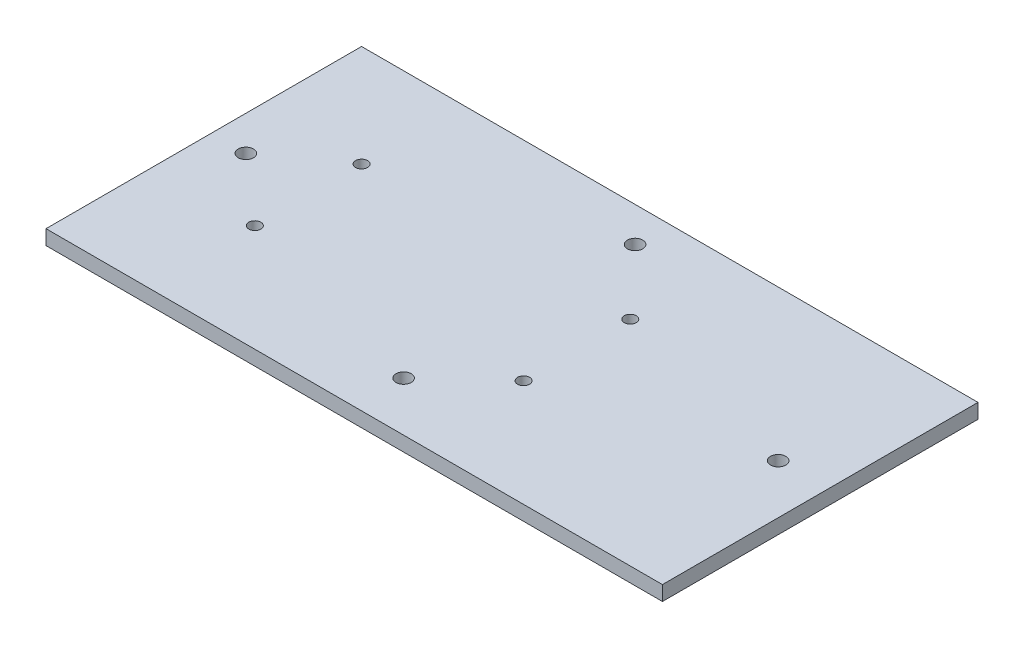
ISO-10303-21;
HEADER;
FILE_DESCRIPTION(('STEP AP214'),'2;1');
FILE_NAME('part.step','',(''),(''),'','','');
FILE_SCHEMA(('AUTOMOTIVE_DESIGN { 1 0 10303 214 1 1 1 1 }'));
ENDSEC;
DATA;
#1=APPLICATION_CONTEXT('core data for automotive mechanical design processes');
#2=APPLICATION_PROTOCOL_DEFINITION('international standard','automotive_design',2000,#1);
#3=PRODUCT_CONTEXT('',#1,'mechanical');
#4=PRODUCT('Part','Part','',(#3));
#5=PRODUCT_RELATED_PRODUCT_CATEGORY('part','',(#4));
#6=PRODUCT_DEFINITION_FORMATION('','',#4);
#7=PRODUCT_DEFINITION_CONTEXT('part definition',#1,'design');
#8=PRODUCT_DEFINITION('design','',#6,#7);
#9=PRODUCT_DEFINITION_SHAPE('','',#8);
#10=(LENGTH_UNIT() NAMED_UNIT(*) SI_UNIT(.MILLI.,.METRE.));
#11=(NAMED_UNIT(*) PLANE_ANGLE_UNIT() SI_UNIT($,.RADIAN.));
#12=(NAMED_UNIT(*) SI_UNIT($,.STERADIAN.) SOLID_ANGLE_UNIT());
#13=UNCERTAINTY_MEASURE_WITH_UNIT(LENGTH_MEASURE(1.E-05),#10,'distance_accuracy_value','');
#14=(GEOMETRIC_REPRESENTATION_CONTEXT(3) GLOBAL_UNCERTAINTY_ASSIGNED_CONTEXT((#13)) GLOBAL_UNIT_ASSIGNED_CONTEXT((#10,
#11,#12)) REPRESENTATION_CONTEXT('',''));
#15=CARTESIAN_POINT('',(0.,0.,0.));
#16=DIRECTION('',(0.,0.,1.));
#17=DIRECTION('',(1.,0.,0.));
#18=AXIS2_PLACEMENT_3D('',#15,#16,#17);
#19=CARTESIAN_POINT('',(0.,3.175,0.));
#20=DIRECTION('',(0.,1.,0.));
#21=DIRECTION('',(0.,0.,1.));
#22=AXIS2_PLACEMENT_3D('',#19,#20,#21);
#23=PLANE('',#22);
#24=CARTESIAN_POINT('',(13.4625,3.175,10.9625));
#25=DIRECTION('',(0.,1.,0.));
#26=DIRECTION('',(0.,0.,1.));
#27=AXIS2_PLACEMENT_3D('',#24,#25,#26);
#28=CIRCLE('',#27,1.3);
#29=CARTESIAN_POINT('',(13.4625,3.175,9.6625));
#30=VERTEX_POINT('',#29);
#31=EDGE_CURVE('E142',#30,#30,#28,.F.);
#32=ORIENTED_EDGE('',*,*,#31,.T.);
#33=EDGE_LOOP('',(#32));
#34=FACE_BOUND('',#33,.T.);
#35=CARTESIAN_POINT('',(13.4625,3.175,-12.0875));
#36=DIRECTION('',(0.,1.,0.));
#37=DIRECTION('',(0.,0.,1.));
#38=AXIS2_PLACEMENT_3D('',#35,#36,#37);
#39=CIRCLE('',#38,1.3);
#40=CARTESIAN_POINT('',(13.4625,3.175,-13.3875));
#41=VERTEX_POINT('',#40);
#42=EDGE_CURVE('E149',#41,#41,#39,.F.);
#43=ORIENTED_EDGE('',*,*,#42,.T.);
#44=EDGE_LOOP('',(#43));
#45=FACE_BOUND('',#44,.T.);
#46=CARTESIAN_POINT('',(-44.5875,3.175,-12.0875));
#47=DIRECTION('',(0.,1.,0.));
#48=DIRECTION('',(0.,0.,1.));
#49=AXIS2_PLACEMENT_3D('',#46,#47,#48);
#50=CIRCLE('',#49,1.3);
#51=CARTESIAN_POINT('',(-44.5875,3.175,-13.3875));
#52=VERTEX_POINT('',#51);
#53=EDGE_CURVE('E141',#52,#52,#50,.F.);
#54=ORIENTED_EDGE('',*,*,#53,.T.);
#55=EDGE_LOOP('',(#54));
#56=FACE_BOUND('',#55,.T.);
#57=CARTESIAN_POINT('',(-44.5875,3.175,10.9625));
#58=DIRECTION('',(0.,1.,0.));
#59=DIRECTION('',(0.,0.,1.));
#60=AXIS2_PLACEMENT_3D('',#57,#58,#59);
#61=CIRCLE('',#60,1.3);
#62=CARTESIAN_POINT('',(-44.5875,3.175,9.6625));
#63=VERTEX_POINT('',#62);
#64=EDGE_CURVE('E133',#63,#63,#61,.F.);
#65=ORIENTED_EDGE('',*,*,#64,.T.);
#66=EDGE_LOOP('',(#65));
#67=FACE_BOUND('',#66,.T.);
#68=CARTESIAN_POINT('',(55.9125,3.175,-1.5875));
#69=DIRECTION('',(0.,1.,0.));
#70=DIRECTION('',(0.,0.,1.));
#71=AXIS2_PLACEMENT_3D('',#68,#69,#70);
#72=CIRCLE('',#71,1.65);
#73=CARTESIAN_POINT('',(55.9125,3.175,0.0625000000000024));
#74=VERTEX_POINT('',#73);
#75=EDGE_CURVE('E121',#74,#74,#72,.T.);
#76=ORIENTED_EDGE('',*,*,#75,.F.);
#77=EDGE_LOOP('',(#76));
#78=FACE_BOUND('',#77,.T.);
#79=CARTESIAN_POINT('',(0.,3.175,-26.5875));
#80=DIRECTION('',(0.,1.,0.));
#81=DIRECTION('',(0.,0.,1.));
#82=AXIS2_PLACEMENT_3D('',#79,#80,#81);
#83=CIRCLE('',#82,1.65);
#84=CARTESIAN_POINT('',(0.,3.175,-24.9375));
#85=VERTEX_POINT('',#84);
#86=EDGE_CURVE('E100',#85,#85,#83,.T.);
#87=ORIENTED_EDGE('',*,*,#86,.F.);
#88=EDGE_LOOP('',(#87));
#89=FACE_BOUND('',#88,.T.);
#90=DIRECTION('',(0.,0.,-1.));
#91=VECTOR('',#90,1.);
#92=CARTESIAN_POINT('',(66.5875,3.175,-34.0875));
#93=LINE('',#92,#91);
#94=CARTESIAN_POINT('',(66.5875,3.175,34.0875));
#95=VERTEX_POINT('',#94);
#96=CARTESIAN_POINT('',(66.5875,3.175,-34.0875));
#97=VERTEX_POINT('',#96);
#98=EDGE_CURVE('E85',#95,#97,#93,.T.);
#99=ORIENTED_EDGE('',*,*,#98,.T.);
#100=DIRECTION('',(-1.,0.,0.));
#101=VECTOR('',#100,1.);
#102=CARTESIAN_POINT('',(-66.5875,3.175,-34.0875));
#103=LINE('',#102,#101);
#104=CARTESIAN_POINT('',(-66.5875,3.175,-34.0875));
#105=VERTEX_POINT('',#104);
#106=EDGE_CURVE('E80',#97,#105,#103,.T.);
#107=ORIENTED_EDGE('',*,*,#106,.T.);
#108=DIRECTION('',(0.,0.,1.));
#109=VECTOR('',#108,1.);
#110=CARTESIAN_POINT('',(-66.5875,3.175,-34.0875));
#111=LINE('',#110,#109);
#112=CARTESIAN_POINT('',(-66.5875,3.175,34.0875));
#113=VERTEX_POINT('',#112);
#114=EDGE_CURVE('E83',#105,#113,#111,.T.);
#115=ORIENTED_EDGE('',*,*,#114,.T.);
#116=DIRECTION('',(1.,0.,0.));
#117=VECTOR('',#116,1.);
#118=CARTESIAN_POINT('',(-66.5875,3.175,34.0875));
#119=LINE('',#118,#117);
#120=EDGE_CURVE('E50',#113,#95,#119,.T.);
#121=ORIENTED_EDGE('',*,*,#120,.T.);
#122=EDGE_LOOP('',(#99,#107,#115,#121));
#123=FACE_BOUND('',#122,.T.);
#124=CARTESIAN_POINT('',(-59.0875,3.175,-1.5875));
#125=DIRECTION('',(0.,1.,0.));
#126=DIRECTION('',(0.,0.,1.));
#127=AXIS2_PLACEMENT_3D('',#124,#125,#126);
#128=CIRCLE('',#127,1.65);
#129=CARTESIAN_POINT('',(-59.0875,3.175,0.0625000000000024));
#130=VERTEX_POINT('',#129);
#131=EDGE_CURVE('E115',#130,#130,#128,.T.);
#132=ORIENTED_EDGE('',*,*,#131,.F.);
#133=EDGE_LOOP('',(#132));
#134=FACE_BOUND('',#133,.T.);
#135=CARTESIAN_POINT('',(0.,3.175,23.4125));
#136=DIRECTION('',(0.,1.,0.));
#137=DIRECTION('',(0.,0.,1.));
#138=AXIS2_PLACEMENT_3D('',#135,#136,#137);
#139=CIRCLE('',#138,1.65);
#140=CARTESIAN_POINT('',(0.,3.175,25.0625));
#141=VERTEX_POINT('',#140);
#142=EDGE_CURVE('E127',#141,#141,#139,.T.);
#143=ORIENTED_EDGE('',*,*,#142,.F.);
#144=EDGE_LOOP('',(#143));
#145=FACE_BOUND('',#144,.T.);
#146=ADVANCED_FACE('F33',(#34,#45,#56,#67,#78,#89,#123,#134,#145),#23,.T.);
#147=CARTESIAN_POINT('',(0.,0.,0.));
#148=DIRECTION('',(0.,1.,0.));
#149=DIRECTION('',(0.,0.,1.));
#150=AXIS2_PLACEMENT_3D('',#147,#148,#149);
#151=PLANE('',#150);
#152=CARTESIAN_POINT('',(13.4625,0.,10.9625));
#153=DIRECTION('',(0.,-1.,0.));
#154=DIRECTION('',(0.,0.,-1.));
#155=AXIS2_PLACEMENT_3D('',#152,#153,#154);
#156=CIRCLE('',#155,1.3);
#157=CARTESIAN_POINT('',(13.4625,0.,9.6625));
#158=VERTEX_POINT('',#157);
#159=EDGE_CURVE('E146',#158,#158,#156,.T.);
#160=ORIENTED_EDGE('',*,*,#159,.F.);
#161=EDGE_LOOP('',(#160));
#162=FACE_BOUND('',#161,.T.);
#163=CARTESIAN_POINT('',(13.4625,0.,-12.0875));
#164=DIRECTION('',(0.,-1.,0.));
#165=DIRECTION('',(0.,0.,-1.));
#166=AXIS2_PLACEMENT_3D('',#163,#164,#165);
#167=CIRCLE('',#166,1.3);
#168=CARTESIAN_POINT('',(13.4625,0.,-13.3875));
#169=VERTEX_POINT('',#168);
#170=EDGE_CURVE('E145',#169,#169,#167,.T.);
#171=ORIENTED_EDGE('',*,*,#170,.F.);
#172=EDGE_LOOP('',(#171));
#173=FACE_BOUND('',#172,.T.);
#174=CARTESIAN_POINT('',(-44.5875,0.,-12.0875));
#175=DIRECTION('',(0.,-1.,0.));
#176=DIRECTION('',(0.,0.,-1.));
#177=AXIS2_PLACEMENT_3D('',#174,#175,#176);
#178=CIRCLE('',#177,1.3);
#179=CARTESIAN_POINT('',(-44.5875,0.,-13.3875));
#180=VERTEX_POINT('',#179);
#181=EDGE_CURVE('E152',#180,#180,#178,.T.);
#182=ORIENTED_EDGE('',*,*,#181,.F.);
#183=EDGE_LOOP('',(#182));
#184=FACE_BOUND('',#183,.T.);
#185=CARTESIAN_POINT('',(-44.5875,0.,10.9625));
#186=DIRECTION('',(0.,-1.,0.));
#187=DIRECTION('',(0.,0.,-1.));
#188=AXIS2_PLACEMENT_3D('',#185,#186,#187);
#189=CIRCLE('',#188,1.3);
#190=CARTESIAN_POINT('',(-44.5875,0.,9.6625));
#191=VERTEX_POINT('',#190);
#192=EDGE_CURVE('E138',#191,#191,#189,.T.);
#193=ORIENTED_EDGE('',*,*,#192,.F.);
#194=EDGE_LOOP('',(#193));
#195=FACE_BOUND('',#194,.T.);
#196=DIRECTION('',(0.,0.,-1.));
#197=VECTOR('',#196,1.);
#198=CARTESIAN_POINT('',(66.5875,0.,-34.0875));
#199=LINE('',#198,#197);
#200=CARTESIAN_POINT('',(66.5875,0.,34.0875));
#201=VERTEX_POINT('',#200);
#202=CARTESIAN_POINT('',(66.5875,0.,-34.0875));
#203=VERTEX_POINT('',#202);
#204=EDGE_CURVE('E97',#201,#203,#199,.T.);
#205=ORIENTED_EDGE('',*,*,#204,.F.);
#206=DIRECTION('',(1.,0.,0.));
#207=VECTOR('',#206,1.);
#208=CARTESIAN_POINT('',(-66.5875,0.,34.0875));
#209=LINE('',#208,#207);
#210=CARTESIAN_POINT('',(-66.5875,0.,34.0875));
#211=VERTEX_POINT('',#210);
#212=EDGE_CURVE('E73',#211,#201,#209,.T.);
#213=ORIENTED_EDGE('',*,*,#212,.F.);
#214=DIRECTION('',(0.,0.,1.));
#215=VECTOR('',#214,1.);
#216=CARTESIAN_POINT('',(-66.5875,0.,-34.0875));
#217=LINE('',#216,#215);
#218=CARTESIAN_POINT('',(-66.5875,0.,-34.0875));
#219=VERTEX_POINT('',#218);
#220=EDGE_CURVE('E67',#219,#211,#217,.T.);
#221=ORIENTED_EDGE('',*,*,#220,.F.);
#222=DIRECTION('',(-1.,0.,0.));
#223=VECTOR('',#222,1.);
#224=CARTESIAN_POINT('',(-66.5875,0.,-34.0875));
#225=LINE('',#224,#223);
#226=EDGE_CURVE('E89',#203,#219,#225,.T.);
#227=ORIENTED_EDGE('',*,*,#226,.F.);
#228=EDGE_LOOP('',(#205,#213,#221,#227));
#229=FACE_BOUND('',#228,.T.);
#230=CARTESIAN_POINT('',(0.,0.,-26.5875));
#231=DIRECTION('',(0.,1.,0.));
#232=DIRECTION('',(0.,0.,1.));
#233=AXIS2_PLACEMENT_3D('',#230,#231,#232);
#234=CIRCLE('',#233,1.65);
#235=CARTESIAN_POINT('',(0.,0.,-24.9375));
#236=VERTEX_POINT('',#235);
#237=EDGE_CURVE('E112',#236,#236,#234,.T.);
#238=ORIENTED_EDGE('',*,*,#237,.T.);
#239=EDGE_LOOP('',(#238));
#240=FACE_BOUND('',#239,.T.);
#241=CARTESIAN_POINT('',(-59.0875,0.,-1.5875));
#242=DIRECTION('',(0.,1.,0.));
#243=DIRECTION('',(0.,0.,1.));
#244=AXIS2_PLACEMENT_3D('',#241,#242,#243);
#245=CIRCLE('',#244,1.65);
#246=CARTESIAN_POINT('',(-59.0875,0.,0.0625000000000024));
#247=VERTEX_POINT('',#246);
#248=EDGE_CURVE('E118',#247,#247,#245,.T.);
#249=ORIENTED_EDGE('',*,*,#248,.T.);
#250=EDGE_LOOP('',(#249));
#251=FACE_BOUND('',#250,.T.);
#252=CARTESIAN_POINT('',(55.9125,0.,-1.5875));
#253=DIRECTION('',(0.,1.,0.));
#254=DIRECTION('',(0.,0.,1.));
#255=AXIS2_PLACEMENT_3D('',#252,#253,#254);
#256=CIRCLE('',#255,1.65);
#257=CARTESIAN_POINT('',(55.9125,0.,0.0625000000000024));
#258=VERTEX_POINT('',#257);
#259=EDGE_CURVE('E124',#258,#258,#256,.T.);
#260=ORIENTED_EDGE('',*,*,#259,.T.);
#261=EDGE_LOOP('',(#260));
#262=FACE_BOUND('',#261,.T.);
#263=CARTESIAN_POINT('',(0.,0.,23.4125));
#264=DIRECTION('',(0.,1.,0.));
#265=DIRECTION('',(0.,0.,1.));
#266=AXIS2_PLACEMENT_3D('',#263,#264,#265);
#267=CIRCLE('',#266,1.65);
#268=CARTESIAN_POINT('',(0.,0.,25.0625));
#269=VERTEX_POINT('',#268);
#270=EDGE_CURVE('E130',#269,#269,#267,.T.);
#271=ORIENTED_EDGE('',*,*,#270,.T.);
#272=EDGE_LOOP('',(#271));
#273=FACE_BOUND('',#272,.T.);
#274=ADVANCED_FACE('F108',(#162,#173,#184,#195,#229,#240,#251,#262,#273),#151,.F.);
#275=CARTESIAN_POINT('',(66.5875,3.175,-34.0875));
#276=DIRECTION('',(-1.,0.,0.));
#277=DIRECTION('',(0.,0.,1.));
#278=AXIS2_PLACEMENT_3D('',#275,#276,#277);
#279=PLANE('',#278);
#280=ORIENTED_EDGE('',*,*,#204,.T.);
#281=DIRECTION('',(0.,-1.,0.));
#282=VECTOR('',#281,1.);
#283=CARTESIAN_POINT('',(66.5875,3.175,-34.0875));
#284=LINE('',#283,#282);
#285=EDGE_CURVE('E11',#97,#203,#284,.T.);
#286=ORIENTED_EDGE('',*,*,#285,.F.);
#287=ORIENTED_EDGE('',*,*,#98,.F.);
#288=DIRECTION('',(0.,-1.,0.));
#289=VECTOR('',#288,1.);
#290=CARTESIAN_POINT('',(66.5875,3.175,34.0875));
#291=LINE('',#290,#289);
#292=EDGE_CURVE('E93',#95,#201,#291,.T.);
#293=ORIENTED_EDGE('',*,*,#292,.T.);
#294=EDGE_LOOP('',(#280,#286,#287,#293));
#295=FACE_BOUND('',#294,.T.);
#296=ADVANCED_FACE('F35',(#295),#279,.F.);
#297=CARTESIAN_POINT('',(-66.5875,3.175,-34.0875));
#298=DIRECTION('',(0.,0.,1.));
#299=DIRECTION('',(1.,0.,0.));
#300=AXIS2_PLACEMENT_3D('',#297,#298,#299);
#301=PLANE('',#300);
#302=ORIENTED_EDGE('',*,*,#226,.T.);
#303=DIRECTION('',(0.,-1.,0.));
#304=VECTOR('',#303,1.);
#305=CARTESIAN_POINT('',(-66.5875,3.175,-34.0875));
#306=LINE('',#305,#304);
#307=EDGE_CURVE('E42',#105,#219,#306,.T.);
#308=ORIENTED_EDGE('',*,*,#307,.F.);
#309=ORIENTED_EDGE('',*,*,#106,.F.);
#310=ORIENTED_EDGE('',*,*,#285,.T.);
#311=EDGE_LOOP('',(#302,#308,#309,#310));
#312=FACE_BOUND('',#311,.T.);
#313=ADVANCED_FACE('F88',(#312),#301,.F.);
#314=CARTESIAN_POINT('',(-66.5875,3.175,-34.0875));
#315=DIRECTION('',(1.,0.,0.));
#316=DIRECTION('',(0.,0.,-1.));
#317=AXIS2_PLACEMENT_3D('',#314,#315,#316);
#318=PLANE('',#317);
#319=ORIENTED_EDGE('',*,*,#220,.T.);
#320=DIRECTION('',(0.,-1.,0.));
#321=VECTOR('',#320,1.);
#322=CARTESIAN_POINT('',(-66.5875,3.175,34.0875));
#323=LINE('',#322,#321);
#324=EDGE_CURVE('E90',#113,#211,#323,.T.);
#325=ORIENTED_EDGE('',*,*,#324,.F.);
#326=ORIENTED_EDGE('',*,*,#114,.F.);
#327=ORIENTED_EDGE('',*,*,#307,.T.);
#328=EDGE_LOOP('',(#319,#325,#326,#327));
#329=FACE_BOUND('',#328,.T.);
#330=ADVANCED_FACE('F91',(#329),#318,.F.);
#331=CARTESIAN_POINT('',(-66.5875,3.175,34.0875));
#332=DIRECTION('',(0.,0.,-1.));
#333=DIRECTION('',(-1.,0.,0.));
#334=AXIS2_PLACEMENT_3D('',#331,#332,#333);
#335=PLANE('',#334);
#336=ORIENTED_EDGE('',*,*,#212,.T.);
#337=ORIENTED_EDGE('',*,*,#292,.F.);
#338=ORIENTED_EDGE('',*,*,#120,.F.);
#339=ORIENTED_EDGE('',*,*,#324,.T.);
#340=EDGE_LOOP('',(#336,#337,#338,#339));
#341=FACE_BOUND('',#340,.T.);
#342=ADVANCED_FACE('F105',(#341),#335,.F.);
#343=CARTESIAN_POINT('',(0.,3.175,-26.5875));
#344=DIRECTION('',(0.,-1.,0.));
#345=DIRECTION('',(0.,0.,-1.));
#346=AXIS2_PLACEMENT_3D('',#343,#344,#345);
#347=CYLINDRICAL_SURFACE('',#346,1.65);
#348=ORIENTED_EDGE('',*,*,#86,.T.);
#349=EDGE_LOOP('',(#348));
#350=FACE_BOUND('',#349,.T.);
#351=ORIENTED_EDGE('',*,*,#237,.F.);
#352=EDGE_LOOP('',(#351));
#353=FACE_BOUND('',#352,.T.);
#354=ADVANCED_FACE('F184',(#350,#353),#347,.F.);
#355=CARTESIAN_POINT('',(-59.0875,3.175,-1.5875));
#356=DIRECTION('',(0.,-1.,0.));
#357=DIRECTION('',(0.,0.,-1.));
#358=AXIS2_PLACEMENT_3D('',#355,#356,#357);
#359=CYLINDRICAL_SURFACE('',#358,1.65);
#360=ORIENTED_EDGE('',*,*,#131,.T.);
#361=EDGE_LOOP('',(#360));
#362=FACE_BOUND('',#361,.T.);
#363=ORIENTED_EDGE('',*,*,#248,.F.);
#364=EDGE_LOOP('',(#363));
#365=FACE_BOUND('',#364,.T.);
#366=ADVANCED_FACE('F187',(#362,#365),#359,.F.);
#367=CARTESIAN_POINT('',(55.9125,3.175,-1.5875));
#368=DIRECTION('',(0.,-1.,0.));
#369=DIRECTION('',(0.,0.,-1.));
#370=AXIS2_PLACEMENT_3D('',#367,#368,#369);
#371=CYLINDRICAL_SURFACE('',#370,1.65);
#372=ORIENTED_EDGE('',*,*,#75,.T.);
#373=EDGE_LOOP('',(#372));
#374=FACE_BOUND('',#373,.T.);
#375=ORIENTED_EDGE('',*,*,#259,.F.);
#376=EDGE_LOOP('',(#375));
#377=FACE_BOUND('',#376,.T.);
#378=ADVANCED_FACE('F198',(#374,#377),#371,.F.);
#379=CARTESIAN_POINT('',(0.,3.175,23.4125));
#380=DIRECTION('',(0.,-1.,0.));
#381=DIRECTION('',(0.,0.,-1.));
#382=AXIS2_PLACEMENT_3D('',#379,#380,#381);
#383=CYLINDRICAL_SURFACE('',#382,1.65);
#384=ORIENTED_EDGE('',*,*,#142,.T.);
#385=EDGE_LOOP('',(#384));
#386=FACE_BOUND('',#385,.T.);
#387=ORIENTED_EDGE('',*,*,#270,.F.);
#388=EDGE_LOOP('',(#387));
#389=FACE_BOUND('',#388,.T.);
#390=ADVANCED_FACE('F172',(#386,#389),#383,.F.);
#391=CARTESIAN_POINT('',(-44.5875,6.85195526217005,10.9625));
#392=DIRECTION('',(0.,-1.,0.));
#393=DIRECTION('',(0.,0.,-1.));
#394=AXIS2_PLACEMENT_3D('',#391,#392,#393);
#395=CYLINDRICAL_SURFACE('',#394,1.3);
#396=CARTESIAN_POINT('',(-44.5875,0.,9.6625));
#397=CARTESIAN_POINT('',(-44.5875,0.0330729166666668,9.6625));
#398=CARTESIAN_POINT('',(-44.5875,0.0661458333333336,9.6625));
#399=CARTESIAN_POINT('',(-44.5875,0.132291666666667,9.6625));
#400=CARTESIAN_POINT('',(-44.5875,0.165364583333333,9.6625));
#401=CARTESIAN_POINT('',(-44.5875,0.231510416666667,9.6625));
#402=CARTESIAN_POINT('',(-44.5875,0.264583333333333,9.6625));
#403=CARTESIAN_POINT('',(-44.5875,0.330729166666667,9.6625));
#404=CARTESIAN_POINT('',(-44.5875,0.363802083333333,9.6625));
#405=CARTESIAN_POINT('',(-44.5875,0.429947916666666,9.6625));
#406=CARTESIAN_POINT('',(-44.5875,0.463020833333333,9.6625));
#407=CARTESIAN_POINT('',(-44.5875,0.529166666666667,9.6625));
#408=CARTESIAN_POINT('',(-44.5875,0.562239583333334,9.6625));
#409=CARTESIAN_POINT('',(-44.5875,0.628385416666667,9.6625));
#410=CARTESIAN_POINT('',(-44.5875,0.661458333333333,9.6625));
#411=CARTESIAN_POINT('',(-44.5875,0.727604166666667,9.6625));
#412=CARTESIAN_POINT('',(-44.5875,0.760677083333333,9.6625));
#413=CARTESIAN_POINT('',(-44.5875,0.826822916666667,9.6625));
#414=CARTESIAN_POINT('',(-44.5875,0.859895833333333,9.6625));
#415=CARTESIAN_POINT('',(-44.5875,0.926041666666666,9.6625));
#416=CARTESIAN_POINT('',(-44.5875,0.959114583333333,9.6625));
#417=CARTESIAN_POINT('',(-44.5875,1.02526041666667,9.6625));
#418=CARTESIAN_POINT('',(-44.5875,1.05833333333333,9.6625));
#419=CARTESIAN_POINT('',(-44.5875,1.12447916666667,9.6625));
#420=CARTESIAN_POINT('',(-44.5875,1.15755208333333,9.6625));
#421=CARTESIAN_POINT('',(-44.5875,1.22369791666667,9.6625));
#422=CARTESIAN_POINT('',(-44.5875,1.25677083333333,9.6625));
#423=CARTESIAN_POINT('',(-44.5875,1.32291666666667,9.6625));
#424=CARTESIAN_POINT('',(-44.5875,1.35598958333333,9.6625));
#425=CARTESIAN_POINT('',(-44.5875,1.42213541666667,9.6625));
#426=CARTESIAN_POINT('',(-44.5875,1.45520833333333,9.6625));
#427=CARTESIAN_POINT('',(-44.5875,1.52135416666667,9.6625));
#428=CARTESIAN_POINT('',(-44.5875,1.55442708333333,9.6625));
#429=CARTESIAN_POINT('',(-44.5875,1.62057291666667,9.6625));
#430=CARTESIAN_POINT('',(-44.5875,1.65364583333333,9.6625));
#431=CARTESIAN_POINT('',(-44.5875,1.71979166666667,9.6625));
#432=CARTESIAN_POINT('',(-44.5875,1.75286458333333,9.6625));
#433=CARTESIAN_POINT('',(-44.5875,1.81901041666667,9.6625));
#434=CARTESIAN_POINT('',(-44.5875,1.85208333333333,9.6625));
#435=CARTESIAN_POINT('',(-44.5875,1.91822916666667,9.6625));
#436=CARTESIAN_POINT('',(-44.5875,1.95130208333333,9.6625));
#437=CARTESIAN_POINT('',(-44.5875,2.01744791666667,9.6625));
#438=CARTESIAN_POINT('',(-44.5875,2.05052083333333,9.6625));
#439=CARTESIAN_POINT('',(-44.5875,2.11666666666667,9.6625));
#440=CARTESIAN_POINT('',(-44.5875,2.14973958333333,9.6625));
#441=CARTESIAN_POINT('',(-44.5875,2.21588541666667,9.6625));
#442=CARTESIAN_POINT('',(-44.5875,2.24895833333333,9.6625));
#443=CARTESIAN_POINT('',(-44.5875,2.31510416666667,9.6625));
#444=CARTESIAN_POINT('',(-44.5875,2.34817708333333,9.6625));
#445=CARTESIAN_POINT('',(-44.5875,2.41432291666667,9.6625));
#446=CARTESIAN_POINT('',(-44.5875,2.44739583333333,9.6625));
#447=CARTESIAN_POINT('',(-44.5875,2.51354166666667,9.6625));
#448=CARTESIAN_POINT('',(-44.5875,2.54661458333333,9.6625));
#449=CARTESIAN_POINT('',(-44.5875,2.61276041666667,9.6625));
#450=CARTESIAN_POINT('',(-44.5875,2.64583333333333,9.6625));
#451=CARTESIAN_POINT('',(-44.5875,2.71197916666667,9.6625));
#452=CARTESIAN_POINT('',(-44.5875,2.74505208333333,9.6625));
#453=CARTESIAN_POINT('',(-44.5875,2.81119791666667,9.6625));
#454=CARTESIAN_POINT('',(-44.5875,2.84427083333333,9.6625));
#455=CARTESIAN_POINT('',(-44.5875,2.91041666666667,9.6625));
#456=CARTESIAN_POINT('',(-44.5875,2.94348958333333,9.6625));
#457=CARTESIAN_POINT('',(-44.5875,3.00963541666667,9.6625));
#458=CARTESIAN_POINT('',(-44.5875,3.04270833333333,9.6625));
#459=CARTESIAN_POINT('',(-44.5875,3.10885416666667,9.6625));
#460=CARTESIAN_POINT('',(-44.5875,3.14192708333333,9.6625));
#461=CARTESIAN_POINT('',(-44.5875,3.175,9.6625));
#462=B_SPLINE_CURVE_WITH_KNOTS('',3,(#396,#397,#398,#399,#400,#401,#402,#403,#404,#405,#406,
#407,#408,#409,#410,#411,#412,#413,#414,#415,#416,#417,#418,#419,#420,#421,#422,#423,#424,#425,
#426,#427,#428,#429,#430,#431,#432,#433,#434,#435,#436,#437,#438,#439,#440,#441,#442,#443,#444,
#445,#446,#447,#448,#449,#450,#451,#452,#453,#454,#455,#456,#457,#458,#459,#460,#461),
.UNSPECIFIED.,.F.,.F.,(4,2,2,2,2,2,2,2,2,2,2,2,2,2,2,2,2,2,2,2,2,2,2,2,2,2,2,2,2,2,2,2,4),(0.,
0.0992187500000004,0.1984375,0.29765625,0.396875,0.49609375,0.5953125,0.69453125,0.79375,
0.89296875,0.9921875,1.09140625,1.190625,1.28984375,1.3890625,1.48828125,1.5875,1.68671875,
1.7859375,1.88515625,1.984375,2.08359375,2.1828125,2.28203125,2.38125,2.48046875,2.5796875,
2.67890625,2.778125,2.87734375,2.9765625,3.07578125,3.175),.UNSPECIFIED.);
#463=EDGE_CURVE('BSEAM169',#191,#63,#462,.T.);
#464=ORIENTED_EDGE('',*,*,#192,.T.);
#465=ORIENTED_EDGE('',*,*,#64,.F.);
#466=ORIENTED_EDGE('',*,*,#463,.T.);
#467=ORIENTED_EDGE('',*,*,#463,.F.);
#468=EDGE_LOOP('',(#464,#466,#465,#467));
#469=FACE_BOUND('',#468,.T.);
#470=ADVANCED_FACE('F169',(#469),#395,.F.);
#471=CARTESIAN_POINT('',(-44.5875,6.85195526217005,-12.0875));
#472=DIRECTION('',(0.,-1.,0.));
#473=DIRECTION('',(0.,0.,-1.));
#474=AXIS2_PLACEMENT_3D('',#471,#472,#473);
#475=CYLINDRICAL_SURFACE('',#474,1.3);
#476=CARTESIAN_POINT('',(-44.5875,0.,-13.3875));
#477=CARTESIAN_POINT('',(-44.5875,0.0330729166666668,-13.3875));
#478=CARTESIAN_POINT('',(-44.5875,0.0661458333333336,-13.3875));
#479=CARTESIAN_POINT('',(-44.5875,0.132291666666667,-13.3875));
#480=CARTESIAN_POINT('',(-44.5875,0.165364583333333,-13.3875));
#481=CARTESIAN_POINT('',(-44.5875,0.231510416666667,-13.3875));
#482=CARTESIAN_POINT('',(-44.5875,0.264583333333333,-13.3875));
#483=CARTESIAN_POINT('',(-44.5875,0.330729166666667,-13.3875));
#484=CARTESIAN_POINT('',(-44.5875,0.363802083333333,-13.3875));
#485=CARTESIAN_POINT('',(-44.5875,0.429947916666666,-13.3875));
#486=CARTESIAN_POINT('',(-44.5875,0.463020833333333,-13.3875));
#487=CARTESIAN_POINT('',(-44.5875,0.529166666666667,-13.3875));
#488=CARTESIAN_POINT('',(-44.5875,0.562239583333334,-13.3875));
#489=CARTESIAN_POINT('',(-44.5875,0.628385416666667,-13.3875));
#490=CARTESIAN_POINT('',(-44.5875,0.661458333333333,-13.3875));
#491=CARTESIAN_POINT('',(-44.5875,0.727604166666667,-13.3875));
#492=CARTESIAN_POINT('',(-44.5875,0.760677083333333,-13.3875));
#493=CARTESIAN_POINT('',(-44.5875,0.826822916666667,-13.3875));
#494=CARTESIAN_POINT('',(-44.5875,0.859895833333333,-13.3875));
#495=CARTESIAN_POINT('',(-44.5875,0.926041666666666,-13.3875));
#496=CARTESIAN_POINT('',(-44.5875,0.959114583333333,-13.3875));
#497=CARTESIAN_POINT('',(-44.5875,1.02526041666667,-13.3875));
#498=CARTESIAN_POINT('',(-44.5875,1.05833333333333,-13.3875));
#499=CARTESIAN_POINT('',(-44.5875,1.12447916666667,-13.3875));
#500=CARTESIAN_POINT('',(-44.5875,1.15755208333333,-13.3875));
#501=CARTESIAN_POINT('',(-44.5875,1.22369791666667,-13.3875));
#502=CARTESIAN_POINT('',(-44.5875,1.25677083333333,-13.3875));
#503=CARTESIAN_POINT('',(-44.5875,1.32291666666667,-13.3875));
#504=CARTESIAN_POINT('',(-44.5875,1.35598958333333,-13.3875));
#505=CARTESIAN_POINT('',(-44.5875,1.42213541666667,-13.3875));
#506=CARTESIAN_POINT('',(-44.5875,1.45520833333333,-13.3875));
#507=CARTESIAN_POINT('',(-44.5875,1.52135416666667,-13.3875));
#508=CARTESIAN_POINT('',(-44.5875,1.55442708333333,-13.3875));
#509=CARTESIAN_POINT('',(-44.5875,1.62057291666667,-13.3875));
#510=CARTESIAN_POINT('',(-44.5875,1.65364583333333,-13.3875));
#511=CARTESIAN_POINT('',(-44.5875,1.71979166666667,-13.3875));
#512=CARTESIAN_POINT('',(-44.5875,1.75286458333333,-13.3875));
#513=CARTESIAN_POINT('',(-44.5875,1.81901041666667,-13.3875));
#514=CARTESIAN_POINT('',(-44.5875,1.85208333333333,-13.3875));
#515=CARTESIAN_POINT('',(-44.5875,1.91822916666667,-13.3875));
#516=CARTESIAN_POINT('',(-44.5875,1.95130208333333,-13.3875));
#517=CARTESIAN_POINT('',(-44.5875,2.01744791666667,-13.3875));
#518=CARTESIAN_POINT('',(-44.5875,2.05052083333333,-13.3875));
#519=CARTESIAN_POINT('',(-44.5875,2.11666666666667,-13.3875));
#520=CARTESIAN_POINT('',(-44.5875,2.14973958333333,-13.3875));
#521=CARTESIAN_POINT('',(-44.5875,2.21588541666667,-13.3875));
#522=CARTESIAN_POINT('',(-44.5875,2.24895833333333,-13.3875));
#523=CARTESIAN_POINT('',(-44.5875,2.31510416666667,-13.3875));
#524=CARTESIAN_POINT('',(-44.5875,2.34817708333333,-13.3875));
#525=CARTESIAN_POINT('',(-44.5875,2.41432291666667,-13.3875));
#526=CARTESIAN_POINT('',(-44.5875,2.44739583333333,-13.3875));
#527=CARTESIAN_POINT('',(-44.5875,2.51354166666667,-13.3875));
#528=CARTESIAN_POINT('',(-44.5875,2.54661458333333,-13.3875));
#529=CARTESIAN_POINT('',(-44.5875,2.61276041666667,-13.3875));
#530=CARTESIAN_POINT('',(-44.5875,2.64583333333333,-13.3875));
#531=CARTESIAN_POINT('',(-44.5875,2.71197916666667,-13.3875));
#532=CARTESIAN_POINT('',(-44.5875,2.74505208333333,-13.3875));
#533=CARTESIAN_POINT('',(-44.5875,2.81119791666667,-13.3875));
#534=CARTESIAN_POINT('',(-44.5875,2.84427083333333,-13.3875));
#535=CARTESIAN_POINT('',(-44.5875,2.91041666666667,-13.3875));
#536=CARTESIAN_POINT('',(-44.5875,2.94348958333333,-13.3875));
#537=CARTESIAN_POINT('',(-44.5875,3.00963541666667,-13.3875));
#538=CARTESIAN_POINT('',(-44.5875,3.04270833333333,-13.3875));
#539=CARTESIAN_POINT('',(-44.5875,3.10885416666667,-13.3875));
#540=CARTESIAN_POINT('',(-44.5875,3.14192708333333,-13.3875));
#541=CARTESIAN_POINT('',(-44.5875,3.175,-13.3875));
#542=B_SPLINE_CURVE_WITH_KNOTS('',3,(#476,#477,#478,#479,#480,#481,#482,#483,#484,#485,#486,
#487,#488,#489,#490,#491,#492,#493,#494,#495,#496,#497,#498,#499,#500,#501,#502,#503,#504,#505,
#506,#507,#508,#509,#510,#511,#512,#513,#514,#515,#516,#517,#518,#519,#520,#521,#522,#523,#524,
#525,#526,#527,#528,#529,#530,#531,#532,#533,#534,#535,#536,#537,#538,#539,#540,#541),
.UNSPECIFIED.,.F.,.F.,(4,2,2,2,2,2,2,2,2,2,2,2,2,2,2,2,2,2,2,2,2,2,2,2,2,2,2,2,2,2,2,2,4),(0.,
0.0992187500000004,0.1984375,0.29765625,0.396875,0.49609375,0.5953125,0.69453125,0.79375,
0.89296875,0.9921875,1.09140625,1.190625,1.28984375,1.3890625,1.48828125,1.5875,1.68671875,
1.7859375,1.88515625,1.984375,2.08359375,2.1828125,2.28203125,2.38125,2.48046875,2.5796875,
2.67890625,2.778125,2.87734375,2.9765625,3.07578125,3.175),.UNSPECIFIED.);
#543=EDGE_CURVE('BSEAM160',#180,#52,#542,.T.);
#544=ORIENTED_EDGE('',*,*,#181,.T.);
#545=ORIENTED_EDGE('',*,*,#53,.F.);
#546=ORIENTED_EDGE('',*,*,#543,.T.);
#547=ORIENTED_EDGE('',*,*,#543,.F.);
#548=EDGE_LOOP('',(#544,#546,#545,#547));
#549=FACE_BOUND('',#548,.T.);
#550=ADVANCED_FACE('F160',(#549),#475,.F.);
#551=CARTESIAN_POINT('',(13.4625,6.85195526217005,-12.0875));
#552=DIRECTION('',(0.,-1.,0.));
#553=DIRECTION('',(0.,0.,-1.));
#554=AXIS2_PLACEMENT_3D('',#551,#552,#553);
#555=CYLINDRICAL_SURFACE('',#554,1.3);
#556=CARTESIAN_POINT('',(13.4625,0.,-13.3875));
#557=CARTESIAN_POINT('',(13.4625,0.0330729166666668,-13.3875));
#558=CARTESIAN_POINT('',(13.4625,0.0661458333333336,-13.3875));
#559=CARTESIAN_POINT('',(13.4625,0.132291666666667,-13.3875));
#560=CARTESIAN_POINT('',(13.4625,0.165364583333333,-13.3875));
#561=CARTESIAN_POINT('',(13.4625,0.231510416666667,-13.3875));
#562=CARTESIAN_POINT('',(13.4625,0.264583333333333,-13.3875));
#563=CARTESIAN_POINT('',(13.4625,0.330729166666667,-13.3875));
#564=CARTESIAN_POINT('',(13.4625,0.363802083333333,-13.3875));
#565=CARTESIAN_POINT('',(13.4625,0.429947916666666,-13.3875));
#566=CARTESIAN_POINT('',(13.4625,0.463020833333333,-13.3875));
#567=CARTESIAN_POINT('',(13.4625,0.529166666666667,-13.3875));
#568=CARTESIAN_POINT('',(13.4625,0.562239583333334,-13.3875));
#569=CARTESIAN_POINT('',(13.4625,0.628385416666667,-13.3875));
#570=CARTESIAN_POINT('',(13.4625,0.661458333333333,-13.3875));
#571=CARTESIAN_POINT('',(13.4625,0.727604166666667,-13.3875));
#572=CARTESIAN_POINT('',(13.4625,0.760677083333333,-13.3875));
#573=CARTESIAN_POINT('',(13.4625,0.826822916666667,-13.3875));
#574=CARTESIAN_POINT('',(13.4625,0.859895833333333,-13.3875));
#575=CARTESIAN_POINT('',(13.4625,0.926041666666666,-13.3875));
#576=CARTESIAN_POINT('',(13.4625,0.959114583333333,-13.3875));
#577=CARTESIAN_POINT('',(13.4625,1.02526041666667,-13.3875));
#578=CARTESIAN_POINT('',(13.4625,1.05833333333333,-13.3875));
#579=CARTESIAN_POINT('',(13.4625,1.12447916666667,-13.3875));
#580=CARTESIAN_POINT('',(13.4625,1.15755208333333,-13.3875));
#581=CARTESIAN_POINT('',(13.4625,1.22369791666667,-13.3875));
#582=CARTESIAN_POINT('',(13.4625,1.25677083333333,-13.3875));
#583=CARTESIAN_POINT('',(13.4625,1.32291666666667,-13.3875));
#584=CARTESIAN_POINT('',(13.4625,1.35598958333333,-13.3875));
#585=CARTESIAN_POINT('',(13.4625,1.42213541666667,-13.3875));
#586=CARTESIAN_POINT('',(13.4625,1.45520833333333,-13.3875));
#587=CARTESIAN_POINT('',(13.4625,1.52135416666667,-13.3875));
#588=CARTESIAN_POINT('',(13.4625,1.55442708333333,-13.3875));
#589=CARTESIAN_POINT('',(13.4625,1.62057291666667,-13.3875));
#590=CARTESIAN_POINT('',(13.4625,1.65364583333333,-13.3875));
#591=CARTESIAN_POINT('',(13.4625,1.71979166666667,-13.3875));
#592=CARTESIAN_POINT('',(13.4625,1.75286458333333,-13.3875));
#593=CARTESIAN_POINT('',(13.4625,1.81901041666667,-13.3875));
#594=CARTESIAN_POINT('',(13.4625,1.85208333333333,-13.3875));
#595=CARTESIAN_POINT('',(13.4625,1.91822916666667,-13.3875));
#596=CARTESIAN_POINT('',(13.4625,1.95130208333333,-13.3875));
#597=CARTESIAN_POINT('',(13.4625,2.01744791666667,-13.3875));
#598=CARTESIAN_POINT('',(13.4625,2.05052083333333,-13.3875));
#599=CARTESIAN_POINT('',(13.4625,2.11666666666667,-13.3875));
#600=CARTESIAN_POINT('',(13.4625,2.14973958333333,-13.3875));
#601=CARTESIAN_POINT('',(13.4625,2.21588541666667,-13.3875));
#602=CARTESIAN_POINT('',(13.4625,2.24895833333333,-13.3875));
#603=CARTESIAN_POINT('',(13.4625,2.31510416666667,-13.3875));
#604=CARTESIAN_POINT('',(13.4625,2.34817708333333,-13.3875));
#605=CARTESIAN_POINT('',(13.4625,2.41432291666667,-13.3875));
#606=CARTESIAN_POINT('',(13.4625,2.44739583333333,-13.3875));
#607=CARTESIAN_POINT('',(13.4625,2.51354166666667,-13.3875));
#608=CARTESIAN_POINT('',(13.4625,2.54661458333333,-13.3875));
#609=CARTESIAN_POINT('',(13.4625,2.61276041666667,-13.3875));
#610=CARTESIAN_POINT('',(13.4625,2.64583333333333,-13.3875));
#611=CARTESIAN_POINT('',(13.4625,2.71197916666667,-13.3875));
#612=CARTESIAN_POINT('',(13.4625,2.74505208333333,-13.3875));
#613=CARTESIAN_POINT('',(13.4625,2.81119791666667,-13.3875));
#614=CARTESIAN_POINT('',(13.4625,2.84427083333333,-13.3875));
#615=CARTESIAN_POINT('',(13.4625,2.91041666666667,-13.3875));
#616=CARTESIAN_POINT('',(13.4625,2.94348958333333,-13.3875));
#617=CARTESIAN_POINT('',(13.4625,3.00963541666667,-13.3875));
#618=CARTESIAN_POINT('',(13.4625,3.04270833333333,-13.3875));
#619=CARTESIAN_POINT('',(13.4625,3.10885416666667,-13.3875));
#620=CARTESIAN_POINT('',(13.4625,3.14192708333333,-13.3875));
#621=CARTESIAN_POINT('',(13.4625,3.175,-13.3875));
#622=B_SPLINE_CURVE_WITH_KNOTS('',3,(#556,#557,#558,#559,#560,#561,#562,#563,#564,#565,#566,
#567,#568,#569,#570,#571,#572,#573,#574,#575,#576,#577,#578,#579,#580,#581,#582,#583,#584,#585,
#586,#587,#588,#589,#590,#591,#592,#593,#594,#595,#596,#597,#598,#599,#600,#601,#602,#603,#604,
#605,#606,#607,#608,#609,#610,#611,#612,#613,#614,#615,#616,#617,#618,#619,#620,#621),
.UNSPECIFIED.,.F.,.F.,(4,2,2,2,2,2,2,2,2,2,2,2,2,2,2,2,2,2,2,2,2,2,2,2,2,2,2,2,2,2,2,2,4),(0.,
0.0992187500000004,0.1984375,0.29765625,0.396875,0.49609375,0.5953125,0.69453125,0.79375,
0.89296875,0.9921875,1.09140625,1.190625,1.28984375,1.3890625,1.48828125,1.5875,1.68671875,
1.7859375,1.88515625,1.984375,2.08359375,2.1828125,2.28203125,2.38125,2.48046875,2.5796875,
2.67890625,2.778125,2.87734375,2.9765625,3.07578125,3.175),.UNSPECIFIED.);
#623=EDGE_CURVE('BSEAM285',#169,#41,#622,.T.);
#624=ORIENTED_EDGE('',*,*,#170,.T.);
#625=ORIENTED_EDGE('',*,*,#42,.F.);
#626=ORIENTED_EDGE('',*,*,#623,.T.);
#627=ORIENTED_EDGE('',*,*,#623,.F.);
#628=EDGE_LOOP('',(#624,#626,#625,#627));
#629=FACE_BOUND('',#628,.T.);
#630=ADVANCED_FACE('F285',(#629),#555,.F.);
#631=CARTESIAN_POINT('',(13.4625,6.85195526217005,10.9625));
#632=DIRECTION('',(0.,-1.,0.));
#633=DIRECTION('',(0.,0.,-1.));
#634=AXIS2_PLACEMENT_3D('',#631,#632,#633);
#635=CYLINDRICAL_SURFACE('',#634,1.3);
#636=CARTESIAN_POINT('',(13.4625,0.,9.6625));
#637=CARTESIAN_POINT('',(13.4625,0.0330729166666668,9.6625));
#638=CARTESIAN_POINT('',(13.4625,0.0661458333333336,9.6625));
#639=CARTESIAN_POINT('',(13.4625,0.132291666666667,9.6625));
#640=CARTESIAN_POINT('',(13.4625,0.165364583333333,9.6625));
#641=CARTESIAN_POINT('',(13.4625,0.231510416666667,9.6625));
#642=CARTESIAN_POINT('',(13.4625,0.264583333333333,9.6625));
#643=CARTESIAN_POINT('',(13.4625,0.330729166666667,9.6625));
#644=CARTESIAN_POINT('',(13.4625,0.363802083333333,9.6625));
#645=CARTESIAN_POINT('',(13.4625,0.429947916666666,9.6625));
#646=CARTESIAN_POINT('',(13.4625,0.463020833333333,9.6625));
#647=CARTESIAN_POINT('',(13.4625,0.529166666666667,9.6625));
#648=CARTESIAN_POINT('',(13.4625,0.562239583333334,9.6625));
#649=CARTESIAN_POINT('',(13.4625,0.628385416666667,9.6625));
#650=CARTESIAN_POINT('',(13.4625,0.661458333333333,9.6625));
#651=CARTESIAN_POINT('',(13.4625,0.727604166666667,9.6625));
#652=CARTESIAN_POINT('',(13.4625,0.760677083333333,9.6625));
#653=CARTESIAN_POINT('',(13.4625,0.826822916666667,9.6625));
#654=CARTESIAN_POINT('',(13.4625,0.859895833333333,9.6625));
#655=CARTESIAN_POINT('',(13.4625,0.926041666666666,9.6625));
#656=CARTESIAN_POINT('',(13.4625,0.959114583333333,9.6625));
#657=CARTESIAN_POINT('',(13.4625,1.02526041666667,9.6625));
#658=CARTESIAN_POINT('',(13.4625,1.05833333333333,9.6625));
#659=CARTESIAN_POINT('',(13.4625,1.12447916666667,9.6625));
#660=CARTESIAN_POINT('',(13.4625,1.15755208333333,9.6625));
#661=CARTESIAN_POINT('',(13.4625,1.22369791666667,9.6625));
#662=CARTESIAN_POINT('',(13.4625,1.25677083333333,9.6625));
#663=CARTESIAN_POINT('',(13.4625,1.32291666666667,9.6625));
#664=CARTESIAN_POINT('',(13.4625,1.35598958333333,9.6625));
#665=CARTESIAN_POINT('',(13.4625,1.42213541666667,9.6625));
#666=CARTESIAN_POINT('',(13.4625,1.45520833333333,9.6625));
#667=CARTESIAN_POINT('',(13.4625,1.52135416666667,9.6625));
#668=CARTESIAN_POINT('',(13.4625,1.55442708333333,9.6625));
#669=CARTESIAN_POINT('',(13.4625,1.62057291666667,9.6625));
#670=CARTESIAN_POINT('',(13.4625,1.65364583333333,9.6625));
#671=CARTESIAN_POINT('',(13.4625,1.71979166666667,9.6625));
#672=CARTESIAN_POINT('',(13.4625,1.75286458333333,9.6625));
#673=CARTESIAN_POINT('',(13.4625,1.81901041666667,9.6625));
#674=CARTESIAN_POINT('',(13.4625,1.85208333333333,9.6625));
#675=CARTESIAN_POINT('',(13.4625,1.91822916666667,9.6625));
#676=CARTESIAN_POINT('',(13.4625,1.95130208333333,9.6625));
#677=CARTESIAN_POINT('',(13.4625,2.01744791666667,9.6625));
#678=CARTESIAN_POINT('',(13.4625,2.05052083333333,9.6625));
#679=CARTESIAN_POINT('',(13.4625,2.11666666666667,9.6625));
#680=CARTESIAN_POINT('',(13.4625,2.14973958333333,9.6625));
#681=CARTESIAN_POINT('',(13.4625,2.21588541666667,9.6625));
#682=CARTESIAN_POINT('',(13.4625,2.24895833333333,9.6625));
#683=CARTESIAN_POINT('',(13.4625,2.31510416666667,9.6625));
#684=CARTESIAN_POINT('',(13.4625,2.34817708333333,9.6625));
#685=CARTESIAN_POINT('',(13.4625,2.41432291666667,9.6625));
#686=CARTESIAN_POINT('',(13.4625,2.44739583333333,9.6625));
#687=CARTESIAN_POINT('',(13.4625,2.51354166666667,9.6625));
#688=CARTESIAN_POINT('',(13.4625,2.54661458333333,9.6625));
#689=CARTESIAN_POINT('',(13.4625,2.61276041666667,9.6625));
#690=CARTESIAN_POINT('',(13.4625,2.64583333333333,9.6625));
#691=CARTESIAN_POINT('',(13.4625,2.71197916666667,9.6625));
#692=CARTESIAN_POINT('',(13.4625,2.74505208333333,9.6625));
#693=CARTESIAN_POINT('',(13.4625,2.81119791666667,9.6625));
#694=CARTESIAN_POINT('',(13.4625,2.84427083333333,9.6625));
#695=CARTESIAN_POINT('',(13.4625,2.91041666666667,9.6625));
#696=CARTESIAN_POINT('',(13.4625,2.94348958333333,9.6625));
#697=CARTESIAN_POINT('',(13.4625,3.00963541666667,9.6625));
#698=CARTESIAN_POINT('',(13.4625,3.04270833333333,9.6625));
#699=CARTESIAN_POINT('',(13.4625,3.10885416666667,9.6625));
#700=CARTESIAN_POINT('',(13.4625,3.14192708333333,9.6625));
#701=CARTESIAN_POINT('',(13.4625,3.175,9.6625));
#702=B_SPLINE_CURVE_WITH_KNOTS('',3,(#636,#637,#638,#639,#640,#641,#642,#643,#644,#645,#646,
#647,#648,#649,#650,#651,#652,#653,#654,#655,#656,#657,#658,#659,#660,#661,#662,#663,#664,#665,
#666,#667,#668,#669,#670,#671,#672,#673,#674,#675,#676,#677,#678,#679,#680,#681,#682,#683,#684,
#685,#686,#687,#688,#689,#690,#691,#692,#693,#694,#695,#696,#697,#698,#699,#700,#701),
.UNSPECIFIED.,.F.,.F.,(4,2,2,2,2,2,2,2,2,2,2,2,2,2,2,2,2,2,2,2,2,2,2,2,2,2,2,2,2,2,2,2,4),(0.,
0.0992187500000004,0.1984375,0.29765625,0.396875,0.49609375,0.5953125,0.69453125,0.79375,
0.89296875,0.9921875,1.09140625,1.190625,1.28984375,1.3890625,1.48828125,1.5875,1.68671875,
1.7859375,1.88515625,1.984375,2.08359375,2.1828125,2.28203125,2.38125,2.48046875,2.5796875,
2.67890625,2.778125,2.87734375,2.9765625,3.07578125,3.175),.UNSPECIFIED.);
#703=EDGE_CURVE('BSEAM293',#158,#30,#702,.T.);
#704=ORIENTED_EDGE('',*,*,#159,.T.);
#705=ORIENTED_EDGE('',*,*,#31,.F.);
#706=ORIENTED_EDGE('',*,*,#703,.T.);
#707=ORIENTED_EDGE('',*,*,#703,.F.);
#708=EDGE_LOOP('',(#704,#706,#705,#707));
#709=FACE_BOUND('',#708,.T.);
#710=ADVANCED_FACE('F293',(#709),#635,.F.);
#711=CLOSED_SHELL('',(#146,#274,#296,#313,#330,#342,#354,#366,#378,#390,#470,#550,#630,#710));
#712=MANIFOLD_SOLID_BREP('B2',#711);
#713=ADVANCED_BREP_SHAPE_REPRESENTATION('',(#18,#712),#14);
#714=SHAPE_DEFINITION_REPRESENTATION(#9,#713);
ENDSEC;
END-ISO-10303-21;
